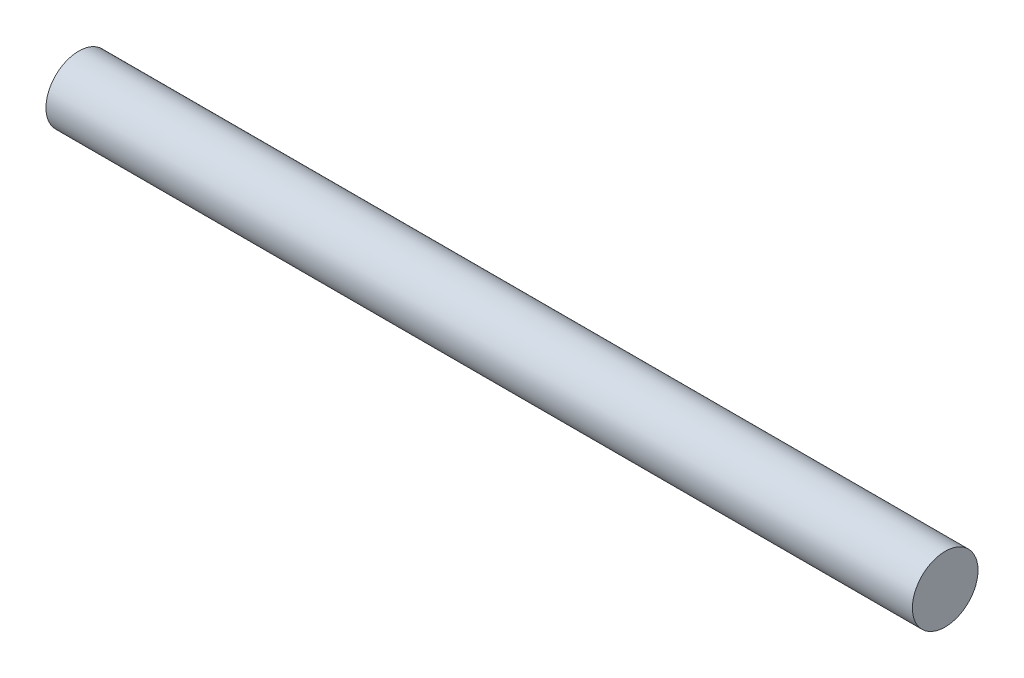
ISO-10303-21;
HEADER;
FILE_DESCRIPTION(('STEP AP214'),'2;1');
FILE_NAME('part.step','',(''),(''),'','','');
FILE_SCHEMA(('AUTOMOTIVE_DESIGN { 1 0 10303 214 1 1 1 1 }'));
ENDSEC;
DATA;
#1=APPLICATION_CONTEXT('core data for automotive mechanical design processes');
#2=APPLICATION_PROTOCOL_DEFINITION('international standard','automotive_design',2000,#1);
#3=PRODUCT_CONTEXT('',#1,'mechanical');
#4=PRODUCT('Part','Part','',(#3));
#5=PRODUCT_RELATED_PRODUCT_CATEGORY('part','',(#4));
#6=PRODUCT_DEFINITION_FORMATION('','',#4);
#7=PRODUCT_DEFINITION_CONTEXT('part definition',#1,'design');
#8=PRODUCT_DEFINITION('design','',#6,#7);
#9=PRODUCT_DEFINITION_SHAPE('','',#8);
#10=(LENGTH_UNIT() NAMED_UNIT(*) SI_UNIT(.MILLI.,.METRE.));
#11=(NAMED_UNIT(*) PLANE_ANGLE_UNIT() SI_UNIT($,.RADIAN.));
#12=(NAMED_UNIT(*) SI_UNIT($,.STERADIAN.) SOLID_ANGLE_UNIT());
#13=UNCERTAINTY_MEASURE_WITH_UNIT(LENGTH_MEASURE(1.E-05),#10,'distance_accuracy_value','');
#14=(GEOMETRIC_REPRESENTATION_CONTEXT(3) GLOBAL_UNCERTAINTY_ASSIGNED_CONTEXT((#13)) GLOBAL_UNIT_ASSIGNED_CONTEXT((#10,
#11,#12)) REPRESENTATION_CONTEXT('',''));
#15=CARTESIAN_POINT('',(0.,0.,0.));
#16=DIRECTION('',(0.,0.,1.));
#17=DIRECTION('',(1.,0.,0.));
#18=AXIS2_PLACEMENT_3D('',#15,#16,#17);
#19=CARTESIAN_POINT('',(1980.,0.,0.));
#20=DIRECTION('',(-1.,0.,0.));
#21=DIRECTION('',(0.,0.,1.));
#22=AXIS2_PLACEMENT_3D('',#19,#20,#21);
#23=CYLINDRICAL_SURFACE('',#22,75.);
#24=CARTESIAN_POINT('',(1980.,0.,0.));
#25=DIRECTION('',(1.,0.,0.));
#26=DIRECTION('',(0.,0.,-1.));
#27=AXIS2_PLACEMENT_3D('',#24,#25,#26);
#28=CIRCLE('',#27,75.);
#29=CARTESIAN_POINT('',(1980.,0.,-75.));
#30=VERTEX_POINT('',#29);
#31=EDGE_CURVE('E10',#30,#30,#28,.T.);
#32=ORIENTED_EDGE('',*,*,#31,.F.);
#33=EDGE_LOOP('',(#32));
#34=FACE_BOUND('',#33,.T.);
#35=CARTESIAN_POINT('',(0.,0.,0.));
#36=DIRECTION('',(1.,0.,0.));
#37=DIRECTION('',(0.,0.,-1.));
#38=AXIS2_PLACEMENT_3D('',#35,#36,#37);
#39=CIRCLE('',#38,75.);
#40=CARTESIAN_POINT('',(0.,0.,-75.));
#41=VERTEX_POINT('',#40);
#42=EDGE_CURVE('E36',#41,#41,#39,.T.);
#43=ORIENTED_EDGE('',*,*,#42,.T.);
#44=EDGE_LOOP('',(#43));
#45=FACE_BOUND('',#44,.T.);
#46=ADVANCED_FACE('F33',(#34,#45),#23,.T.);
#47=CARTESIAN_POINT('',(1980.,0.,0.));
#48=DIRECTION('',(1.,0.,0.));
#49=DIRECTION('',(0.,0.,-1.));
#50=AXIS2_PLACEMENT_3D('',#47,#48,#49);
#51=PLANE('',#50);
#52=ORIENTED_EDGE('',*,*,#31,.T.);
#53=EDGE_LOOP('',(#52));
#54=FACE_BOUND('',#53,.T.);
#55=ADVANCED_FACE('F48',(#54),#51,.T.);
#56=CARTESIAN_POINT('',(0.,0.,0.));
#57=DIRECTION('',(1.,0.,0.));
#58=DIRECTION('',(0.,0.,-1.));
#59=AXIS2_PLACEMENT_3D('',#56,#57,#58);
#60=PLANE('',#59);
#61=ORIENTED_EDGE('',*,*,#42,.F.);
#62=EDGE_LOOP('',(#61));
#63=FACE_BOUND('',#62,.T.);
#64=ADVANCED_FACE('F46',(#63),#60,.F.);
#65=CLOSED_SHELL('',(#46,#55,#64));
#66=MANIFOLD_SOLID_BREP('B2',#65);
#67=ADVANCED_BREP_SHAPE_REPRESENTATION('',(#18,#66),#14);
#68=SHAPE_DEFINITION_REPRESENTATION(#9,#67);
ENDSEC;
END-ISO-10303-21;
